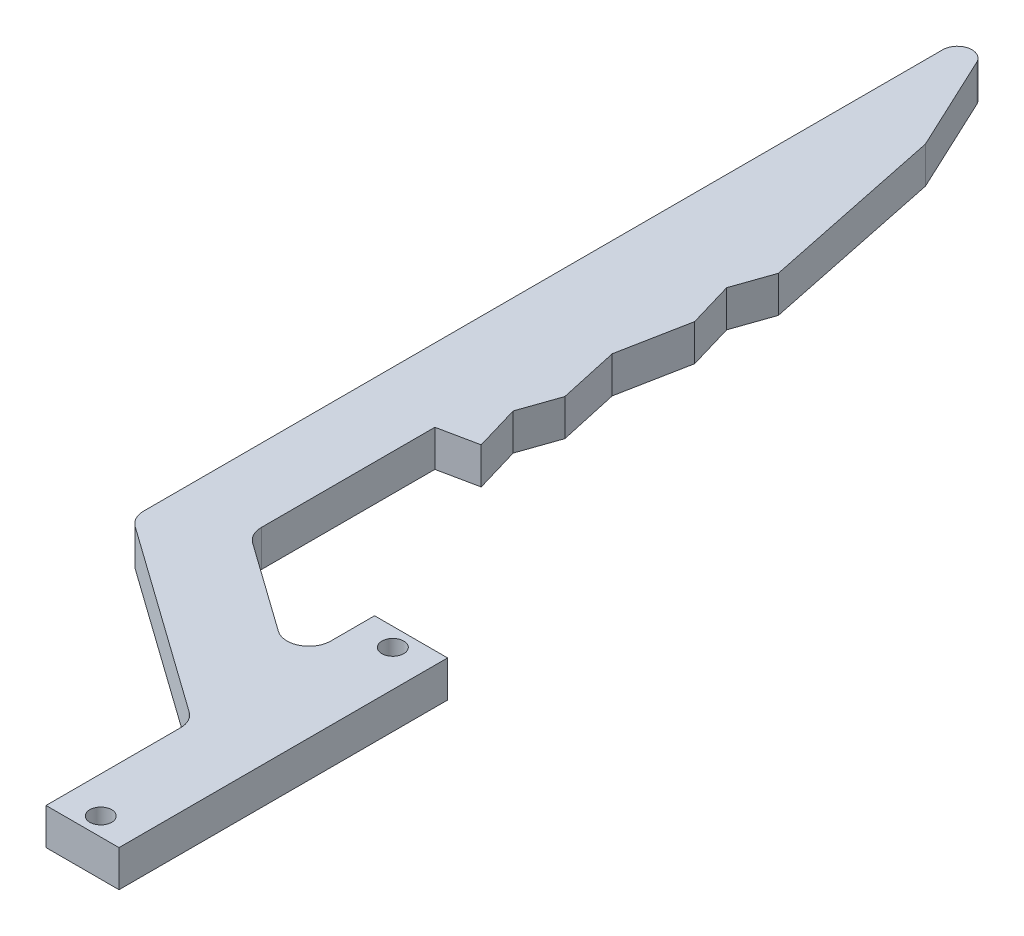
ISO-10303-21;
HEADER;
FILE_DESCRIPTION(('STEP AP214'),'2;1');
FILE_NAME('part.step','',(''),(''),'','','');
FILE_SCHEMA(('AUTOMOTIVE_DESIGN { 1 0 10303 214 1 1 1 1 }'));
ENDSEC;
DATA;
#1=APPLICATION_CONTEXT('core data for automotive mechanical design processes');
#2=APPLICATION_PROTOCOL_DEFINITION('international standard','automotive_design',2000,#1);
#3=PRODUCT_CONTEXT('',#1,'mechanical');
#4=PRODUCT('Part','Part','',(#3));
#5=PRODUCT_RELATED_PRODUCT_CATEGORY('part','',(#4));
#6=PRODUCT_DEFINITION_FORMATION('','',#4);
#7=PRODUCT_DEFINITION_CONTEXT('part definition',#1,'design');
#8=PRODUCT_DEFINITION('design','',#6,#7);
#9=PRODUCT_DEFINITION_SHAPE('','',#8);
#10=(LENGTH_UNIT() NAMED_UNIT(*) SI_UNIT(.MILLI.,.METRE.));
#11=(NAMED_UNIT(*) PLANE_ANGLE_UNIT() SI_UNIT($,.RADIAN.));
#12=(NAMED_UNIT(*) SI_UNIT($,.STERADIAN.) SOLID_ANGLE_UNIT());
#13=UNCERTAINTY_MEASURE_WITH_UNIT(LENGTH_MEASURE(1.E-05),#10,'distance_accuracy_value','');
#14=(GEOMETRIC_REPRESENTATION_CONTEXT(3) GLOBAL_UNCERTAINTY_ASSIGNED_CONTEXT((#13)) GLOBAL_UNIT_ASSIGNED_CONTEXT((#10,
#11,#12)) REPRESENTATION_CONTEXT('',''));
#15=CARTESIAN_POINT('',(0.,0.,0.));
#16=DIRECTION('',(0.,0.,1.));
#17=DIRECTION('',(1.,0.,0.));
#18=AXIS2_PLACEMENT_3D('',#15,#16,#17);
#19=CARTESIAN_POINT('',(-5.,5.,-22.5));
#20=DIRECTION('',(1.,0.,0.));
#21=DIRECTION('',(0.,0.,-1.));
#22=AXIS2_PLACEMENT_3D('',#19,#20,#21);
#23=PLANE('',#22);
#24=DIRECTION('',(0.,0.,1.));
#25=VECTOR('',#24,1.);
#26=CARTESIAN_POINT('',(-5.,5.,-22.5));
#27=LINE('',#26,#25);
#28=CARTESIAN_POINT('',(-5.,5.,4.0698468201842));
#29=VERTEX_POINT('',#28);
#30=CARTESIAN_POINT('',(-5.,5.,22.5));
#31=VERTEX_POINT('',#30);
#32=EDGE_CURVE('E295',#29,#31,#27,.T.);
#33=ORIENTED_EDGE('',*,*,#32,.F.);
#34=DIRECTION('',(0.,1.,0.));
#35=VECTOR('',#34,1.);
#36=CARTESIAN_POINT('',(-5.,0.,4.06984682018421));
#37=LINE('',#36,#35);
#38=CARTESIAN_POINT('',(-5.,0.,4.0698468201842));
#39=VERTEX_POINT('',#38);
#40=EDGE_CURVE('E346',#29,#39,#37,.F.);
#41=ORIENTED_EDGE('',*,*,#40,.T.);
#42=DIRECTION('',(0.,0.,1.));
#43=VECTOR('',#42,1.);
#44=CARTESIAN_POINT('',(-5.,0.,-22.5));
#45=LINE('',#44,#43);
#46=CARTESIAN_POINT('',(-5.,0.,22.5));
#47=VERTEX_POINT('',#46);
#48=EDGE_CURVE('E304',#39,#47,#45,.T.);
#49=ORIENTED_EDGE('',*,*,#48,.T.);
#50=DIRECTION('',(0.,-1.,0.));
#51=VECTOR('',#50,1.);
#52=CARTESIAN_POINT('',(-5.,5.,22.5));
#53=LINE('',#52,#51);
#54=EDGE_CURVE('E315',#31,#47,#53,.T.);
#55=ORIENTED_EDGE('',*,*,#54,.F.);
#56=EDGE_LOOP('',(#33,#41,#49,#55));
#57=FACE_BOUND('',#56,.T.);
#58=ADVANCED_FACE('F43',(#57),#23,.F.);
#59=CARTESIAN_POINT('',(5.,5.,-22.5));
#60=DIRECTION('',(-1.,0.,0.));
#61=DIRECTION('',(0.,0.,1.));
#62=AXIS2_PLACEMENT_3D('',#59,#60,#61);
#63=PLANE('',#62);
#64=DIRECTION('',(0.,0.,-1.));
#65=VECTOR('',#64,1.);
#66=CARTESIAN_POINT('',(5.,0.,-22.5));
#67=LINE('',#66,#65);
#68=CARTESIAN_POINT('',(5.,0.,22.5));
#69=VERTEX_POINT('',#68);
#70=CARTESIAN_POINT('',(5.,0.,-22.5));
#71=VERTEX_POINT('',#70);
#72=EDGE_CURVE('E297',#69,#71,#67,.T.);
#73=ORIENTED_EDGE('',*,*,#72,.T.);
#74=DIRECTION('',(0.,-1.,0.));
#75=VECTOR('',#74,1.);
#76=CARTESIAN_POINT('',(5.,5.,-22.5));
#77=LINE('',#76,#75);
#78=CARTESIAN_POINT('',(5.,5.,-22.5));
#79=VERTEX_POINT('',#78);
#80=EDGE_CURVE('E318',#79,#71,#77,.T.);
#81=ORIENTED_EDGE('',*,*,#80,.F.);
#82=DIRECTION('',(0.,0.,-1.));
#83=VECTOR('',#82,1.);
#84=CARTESIAN_POINT('',(5.,5.,-22.5));
#85=LINE('',#84,#83);
#86=CARTESIAN_POINT('',(5.,5.,22.5));
#87=VERTEX_POINT('',#86);
#88=EDGE_CURVE('E288',#87,#79,#85,.T.);
#89=ORIENTED_EDGE('',*,*,#88,.F.);
#90=DIRECTION('',(0.,-1.,0.));
#91=VECTOR('',#90,1.);
#92=CARTESIAN_POINT('',(5.,5.,22.5));
#93=LINE('',#92,#91);
#94=EDGE_CURVE('E296',#87,#69,#93,.T.);
#95=ORIENTED_EDGE('',*,*,#94,.T.);
#96=EDGE_LOOP('',(#73,#81,#89,#95));
#97=FACE_BOUND('',#96,.T.);
#98=ADVANCED_FACE('F393',(#97),#63,.F.);
#99=CARTESIAN_POINT('',(-5.,5.,-22.5));
#100=DIRECTION('',(0.,0.,1.));
#101=DIRECTION('',(1.,0.,0.));
#102=AXIS2_PLACEMENT_3D('',#99,#100,#101);
#103=PLANE('',#102);
#104=DIRECTION('',(-1.,0.,0.));
#105=VECTOR('',#104,1.);
#106=CARTESIAN_POINT('',(-5.,0.,-22.5));
#107=LINE('',#106,#105);
#108=CARTESIAN_POINT('',(-5.,0.,-22.5));
#109=VERTEX_POINT('',#108);
#110=EDGE_CURVE('E305',#71,#109,#107,.T.);
#111=ORIENTED_EDGE('',*,*,#110,.T.);
#112=DIRECTION('',(0.,-1.,0.));
#113=VECTOR('',#112,1.);
#114=CARTESIAN_POINT('',(-5.,5.,-22.5));
#115=LINE('',#114,#113);
#116=CARTESIAN_POINT('',(-5.,5.,-22.5));
#117=VERTEX_POINT('',#116);
#118=EDGE_CURVE('E312',#117,#109,#115,.T.);
#119=ORIENTED_EDGE('',*,*,#118,.F.);
#120=DIRECTION('',(-1.,0.,0.));
#121=VECTOR('',#120,1.);
#122=CARTESIAN_POINT('',(-5.,5.,-22.5));
#123=LINE('',#122,#121);
#124=EDGE_CURVE('E287',#79,#117,#123,.T.);
#125=ORIENTED_EDGE('',*,*,#124,.F.);
#126=ORIENTED_EDGE('',*,*,#80,.T.);
#127=EDGE_LOOP('',(#111,#119,#125,#126));
#128=FACE_BOUND('',#127,.T.);
#129=ADVANCED_FACE('F399',(#128),#103,.F.);
#130=CARTESIAN_POINT('',(-5.,0.,-16.5095835169366));
#131=VERTEX_POINT('',#130);
#132=EDGE_CURVE('E308',#109,#131,#45,.T.);
#133=ORIENTED_EDGE('',*,*,#132,.T.);
#134=DIRECTION('',(0.,1.,0.));
#135=VECTOR('',#134,1.);
#136=CARTESIAN_POINT('',(-5.,5.,-16.5095835169366));
#137=LINE('',#136,#135);
#138=CARTESIAN_POINT('',(-5.,5.,-16.5095835169366));
#139=VERTEX_POINT('',#138);
#140=EDGE_CURVE('E333',#131,#139,#137,.T.);
#141=ORIENTED_EDGE('',*,*,#140,.T.);
#142=EDGE_CURVE('E291',#117,#139,#27,.T.);
#143=ORIENTED_EDGE('',*,*,#142,.F.);
#144=ORIENTED_EDGE('',*,*,#118,.T.);
#145=EDGE_LOOP('',(#133,#141,#143,#144));
#146=FACE_BOUND('',#145,.T.);
#147=ADVANCED_FACE('F392',(#146),#23,.F.);
#148=CARTESIAN_POINT('',(-5.,5.,22.5));
#149=DIRECTION('',(0.,0.,-1.));
#150=DIRECTION('',(-1.,0.,0.));
#151=AXIS2_PLACEMENT_3D('',#148,#149,#150);
#152=PLANE('',#151);
#153=DIRECTION('',(1.,0.,0.));
#154=VECTOR('',#153,1.);
#155=CARTESIAN_POINT('',(-5.,0.,22.5));
#156=LINE('',#155,#154);
#157=EDGE_CURVE('E289',#47,#69,#156,.T.);
#158=ORIENTED_EDGE('',*,*,#157,.T.);
#159=ORIENTED_EDGE('',*,*,#94,.F.);
#160=DIRECTION('',(1.,0.,0.));
#161=VECTOR('',#160,1.);
#162=CARTESIAN_POINT('',(-5.,5.,22.5));
#163=LINE('',#162,#161);
#164=EDGE_CURVE('E298',#31,#87,#163,.T.);
#165=ORIENTED_EDGE('',*,*,#164,.F.);
#166=ORIENTED_EDGE('',*,*,#54,.T.);
#167=EDGE_LOOP('',(#158,#159,#165,#166));
#168=FACE_BOUND('',#167,.T.);
#169=ADVANCED_FACE('F408',(#168),#152,.F.);
#170=CARTESIAN_POINT('',(0.,5.,0.));
#171=DIRECTION('',(0.,1.,0.));
#172=DIRECTION('',(0.,0.,1.));
#173=AXIS2_PLACEMENT_3D('',#170,#171,#172);
#174=PLANE('',#173);
#175=DIRECTION('',(0.,0.,-1.));
#176=VECTOR('',#175,1.);
#177=CARTESIAN_POINT('',(-33.2276310093814,5.,0.));
#178=LINE('',#177,#176);
#179=CARTESIAN_POINT('',(-33.2276310093814,5.,-19.1253502843522));
#180=VERTEX_POINT('',#179);
#181=CARTESIAN_POINT('',(-33.2276310093814,5.,-128.54358630925));
#182=VERTEX_POINT('',#181);
#183=EDGE_CURVE('E274',#180,#182,#178,.T.);
#184=ORIENTED_EDGE('',*,*,#183,.F.);
#185=CARTESIAN_POINT('',(-30.2276310093814,5.,-19.1253502843522));
#186=DIRECTION('',(0.,1.,0.));
#187=DIRECTION('',(0.,0.,1.));
#188=AXIS2_PLACEMENT_3D('',#185,#186,#187);
#189=CIRCLE('',#188,3.);
#190=CARTESIAN_POINT('',(-31.9678759776965,5.,-16.6816752956816));
#191=VERTEX_POINT('',#190);
#192=EDGE_CURVE('E64',#180,#191,#189,.T.);
#193=ORIENTED_EDGE('',*,*,#192,.T.);
#194=DIRECTION('',(-0.814558329556858,0.,-0.580081656105018));
#195=VECTOR('',#194,1.);
#196=CARTESIAN_POINT('',(-2.87475757798385,5.,4.03677259220125));
#197=LINE('',#196,#195);
#198=CARTESIAN_POINT('',(-6.25975503168495,5.,1.62617183151363));
#199=VERTEX_POINT('',#198);
#200=EDGE_CURVE('E280',#199,#191,#197,.T.);
#201=ORIENTED_EDGE('',*,*,#200,.F.);
#202=CARTESIAN_POINT('',(-8.,5.,4.06984682018421));
#203=DIRECTION('',(0.,1.,0.));
#204=DIRECTION('',(0.,0.,1.));
#205=AXIS2_PLACEMENT_3D('',#202,#203,#204);
#206=CIRCLE('',#205,3.);
#207=EDGE_CURVE('E356',#199,#29,#206,.F.);
#208=ORIENTED_EDGE('',*,*,#207,.T.);
#209=ORIENTED_EDGE('',*,*,#32,.T.);
#210=ORIENTED_EDGE('',*,*,#164,.T.);
#211=ORIENTED_EDGE('',*,*,#88,.T.);
#212=ORIENTED_EDGE('',*,*,#124,.T.);
#213=ORIENTED_EDGE('',*,*,#142,.T.);
#214=CARTESIAN_POINT('',(-8.,5.,-16.5095835169366));
#215=DIRECTION('',(0.,1.,0.));
#216=DIRECTION('',(0.,0.,1.));
#217=AXIS2_PLACEMENT_3D('',#214,#215,#216);
#218=CIRCLE('',#217,3.);
#219=CARTESIAN_POINT('',(-9.74024496831506,5.,-14.065908528266));
#220=VERTEX_POINT('',#219);
#221=EDGE_CURVE('E348',#139,#220,#218,.F.);
#222=ORIENTED_EDGE('',*,*,#221,.T.);
#223=DIRECTION('',(0.814558329556858,0.,0.580081656105018));
#224=VECTOR('',#223,1.);
#225=CARTESIAN_POINT('',(3.36874620983818,5.,-4.73043795904831));
#226=LINE('',#225,#224);
#227=CARTESIAN_POINT('',(-21.9678759776965,5.,-22.7737250084214));
#228=VERTEX_POINT('',#227);
#229=EDGE_CURVE('E269',#228,#220,#226,.T.);
#230=ORIENTED_EDGE('',*,*,#229,.F.);
#231=CARTESIAN_POINT('',(-20.2276310093814,5.,-25.217399997092));
#232=DIRECTION('',(0.,1.,0.));
#233=DIRECTION('',(0.,0.,1.));
#234=AXIS2_PLACEMENT_3D('',#231,#232,#233);
#235=CIRCLE('',#234,3.);
#236=CARTESIAN_POINT('',(-23.2276310093814,5.,-25.217399997092));
#237=VERTEX_POINT('',#236);
#238=EDGE_CURVE('E352',#228,#237,#235,.F.);
#239=ORIENTED_EDGE('',*,*,#238,.T.);
#240=DIRECTION('',(0.,0.,1.));
#241=VECTOR('',#240,1.);
#242=CARTESIAN_POINT('',(-23.2276310093814,5.,0.));
#243=LINE('',#242,#241);
#244=CARTESIAN_POINT('',(-23.2276310093814,5.,-48.9857324203167));
#245=VERTEX_POINT('',#244);
#246=EDGE_CURVE('E224',#245,#237,#243,.T.);
#247=ORIENTED_EDGE('',*,*,#246,.F.);
#248=DIRECTION('',(0.979250718928546,0.,-0.20265248450963));
#249=VECTOR('',#248,1.);
#250=CARTESIAN_POINT('',(-17.9701283005233,5.,-50.0737540736804));
#251=LINE('',#250,#249);
#252=CARTESIAN_POINT('',(-17.9701283005233,5.,-50.0737540736804));
#253=VERTEX_POINT('',#252);
#254=EDGE_CURVE('E205',#245,#253,#251,.T.);
#255=ORIENTED_EDGE('',*,*,#254,.T.);
#256=DIRECTION('',(-0.282825554620811,0.,-0.959171364070796));
#257=VECTOR('',#256,1.);
#258=CARTESIAN_POINT('',(-19.8005117190085,5.,-56.2812955479111));
#259=LINE('',#258,#257);
#260=CARTESIAN_POINT('',(-19.8005117190085,5.,-56.2812955479111));
#261=VERTEX_POINT('',#260);
#262=EDGE_CURVE('E215',#253,#261,#259,.T.);
#263=ORIENTED_EDGE('',*,*,#262,.T.);
#264=DIRECTION('',(0.329137182624405,0.,-0.944282116220607));
#265=VECTOR('',#264,1.);
#266=CARTESIAN_POINT('',(-17.9701283005233,5.,-61.5325962794806));
#267=LINE('',#266,#265);
#268=CARTESIAN_POINT('',(-17.9701283005233,5.,-61.5325962794806));
#269=VERTEX_POINT('',#268);
#270=EDGE_CURVE('E220',#261,#269,#267,.T.);
#271=ORIENTED_EDGE('',*,*,#270,.T.);
#272=DIRECTION('',(-0.21490211562524,0.,-0.976635592582922));
#273=VECTOR('',#272,1.);
#274=CARTESIAN_POINT('',(-19.8005117190085,5.,-69.8508838373545));
#275=LINE('',#274,#273);
#276=CARTESIAN_POINT('',(-19.8005117190085,5.,-69.8508838373545));
#277=VERTEX_POINT('',#276);
#278=EDGE_CURVE('E233',#269,#277,#275,.T.);
#279=ORIENTED_EDGE('',*,*,#278,.T.);
#280=DIRECTION('',(0.18997742787162,0.,-0.981788458324543));
#281=VECTOR('',#280,1.);
#282=CARTESIAN_POINT('',(-17.9701283005233,5.,-79.3101618932283));
#283=LINE('',#282,#281);
#284=CARTESIAN_POINT('',(-17.9701283005233,5.,-79.3101618932283));
#285=VERTEX_POINT('',#284);
#286=EDGE_CURVE('E232',#277,#285,#283,.T.);
#287=ORIENTED_EDGE('',*,*,#286,.T.);
#288=DIRECTION('',(-0.282825554620811,0.,-0.959171364070796));
#289=VECTOR('',#288,1.);
#290=CARTESIAN_POINT('',(-19.8005117190085,5.,-85.517703367459));
#291=LINE('',#290,#289);
#292=CARTESIAN_POINT('',(-19.8005117190085,5.,-85.517703367459));
#293=VERTEX_POINT('',#292);
#294=EDGE_CURVE('E240',#285,#293,#291,.T.);
#295=ORIENTED_EDGE('',*,*,#294,.T.);
#296=DIRECTION('',(0.329137182624406,0.,-0.944282116220607));
#297=VECTOR('',#296,1.);
#298=CARTESIAN_POINT('',(-17.9701283005233,5.,-90.7690040990285));
#299=LINE('',#298,#297);
#300=CARTESIAN_POINT('',(-17.9701283005233,5.,-90.7690040990285));
#301=VERTEX_POINT('',#300);
#302=EDGE_CURVE('E238',#293,#301,#299,.T.);
#303=ORIENTED_EDGE('',*,*,#302,.T.);
#304=DIRECTION('',(-0.20265248450963,0.,-0.979250718928546));
#305=VECTOR('',#304,1.);
#306=CARTESIAN_POINT('',(-23.2276310093814,5.,-116.174137028319));
#307=LINE('',#306,#305);
#308=CARTESIAN_POINT('',(-23.2276310093814,5.,-116.174137028319));
#309=VERTEX_POINT('',#308);
#310=EDGE_CURVE('E241',#301,#309,#307,.T.);
#311=ORIENTED_EDGE('',*,*,#310,.T.);
#312=DIRECTION('',(-0.42404039805158,0.,-0.905643274595609));
#313=VECTOR('',#312,1.);
#314=CARTESIAN_POINT('',(-33.2276310093814,5.,-137.53161331494));
#315=LINE('',#314,#313);
#316=CARTESIAN_POINT('',(-29.4163444601902,5.,-129.391667105353));
#317=VERTEX_POINT('',#316);
#318=EDGE_CURVE('E221',#309,#317,#315,.T.);
#319=ORIENTED_EDGE('',*,*,#318,.T.);
#320=CARTESIAN_POINT('',(-31.2276310093814,5.,-128.54358630925));
#321=DIRECTION('',(0.,1.,0.));
#322=DIRECTION('',(0.,0.,1.));
#323=AXIS2_PLACEMENT_3D('',#320,#321,#322);
#324=CIRCLE('',#323,2.);
#325=EDGE_CURVE('E327',#317,#182,#324,.T.);
#326=ORIENTED_EDGE('',*,*,#325,.T.);
#327=EDGE_LOOP('',(#184,#193,#201,#208,#209,#210,#211,#212,#213,#222,#230,#239,#247,#255,#263,
#271,#279,#287,#295,#303,#311,#319,#326));
#328=FACE_BOUND('',#327,.T.);
#329=CARTESIAN_POINT('',(0.,5.,20.));
#330=DIRECTION('',(0.,1.,0.));
#331=DIRECTION('',(0.,0.,1.));
#332=AXIS2_PLACEMENT_3D('',#329,#330,#331);
#333=CIRCLE('',#332,1.5);
#334=CARTESIAN_POINT('',(0.,5.,21.5));
#335=VERTEX_POINT('',#334);
#336=EDGE_CURVE('E278',#335,#335,#333,.T.);
#337=ORIENTED_EDGE('',*,*,#336,.F.);
#338=EDGE_LOOP('',(#337));
#339=FACE_BOUND('',#338,.T.);
#340=CARTESIAN_POINT('',(0.,5.,-20.));
#341=DIRECTION('',(0.,1.,0.));
#342=DIRECTION('',(0.,0.,1.));
#343=AXIS2_PLACEMENT_3D('',#340,#341,#342);
#344=CIRCLE('',#343,1.5);
#345=CARTESIAN_POINT('',(0.,5.,-18.5));
#346=VERTEX_POINT('',#345);
#347=EDGE_CURVE('E267',#346,#346,#344,.T.);
#348=ORIENTED_EDGE('',*,*,#347,.F.);
#349=EDGE_LOOP('',(#348));
#350=FACE_BOUND('',#349,.T.);
#351=ADVANCED_FACE('F219',(#328,#339,#350),#174,.T.);
#352=CARTESIAN_POINT('',(0.,0.,0.));
#353=DIRECTION('',(0.,1.,0.));
#354=DIRECTION('',(0.,0.,1.));
#355=AXIS2_PLACEMENT_3D('',#352,#353,#354);
#356=PLANE('',#355);
#357=DIRECTION('',(0.814558329556858,0.,0.580081656105018));
#358=VECTOR('',#357,1.);
#359=CARTESIAN_POINT('',(-2.87475757798385,0.,4.03677259220125));
#360=LINE('',#359,#358);
#361=CARTESIAN_POINT('',(-31.9678759776965,0.,-16.6816752956816));
#362=VERTEX_POINT('',#361);
#363=CARTESIAN_POINT('',(-6.25975503168495,0.,1.62617183151363));
#364=VERTEX_POINT('',#363);
#365=EDGE_CURVE('E263',#362,#364,#360,.T.);
#366=ORIENTED_EDGE('',*,*,#365,.F.);
#367=CARTESIAN_POINT('',(-30.2276310093814,0.,-19.1253502843522));
#368=DIRECTION('',(0.,1.,0.));
#369=DIRECTION('',(0.,0.,1.));
#370=AXIS2_PLACEMENT_3D('',#367,#368,#369);
#371=CIRCLE('',#370,3.);
#372=CARTESIAN_POINT('',(-33.2276310093814,0.,-19.1253502843522));
#373=VERTEX_POINT('',#372);
#374=EDGE_CURVE('E11',#362,#373,#371,.F.);
#375=ORIENTED_EDGE('',*,*,#374,.T.);
#376=DIRECTION('',(0.,0.,1.));
#377=VECTOR('',#376,1.);
#378=CARTESIAN_POINT('',(-33.2276310093814,0.,0.));
#379=LINE('',#378,#377);
#380=CARTESIAN_POINT('',(-33.2276310093814,0.,-128.54358630925));
#381=VERTEX_POINT('',#380);
#382=EDGE_CURVE('E257',#381,#373,#379,.T.);
#383=ORIENTED_EDGE('',*,*,#382,.F.);
#384=CARTESIAN_POINT('',(-31.2276310093814,0.,-128.54358630925));
#385=DIRECTION('',(0.,1.,0.));
#386=DIRECTION('',(0.,0.,1.));
#387=AXIS2_PLACEMENT_3D('',#384,#385,#386);
#388=CIRCLE('',#387,2.);
#389=CARTESIAN_POINT('',(-29.4163444601902,0.,-129.391667105353));
#390=VERTEX_POINT('',#389);
#391=EDGE_CURVE('E334',#381,#390,#388,.F.);
#392=ORIENTED_EDGE('',*,*,#391,.T.);
#393=DIRECTION('',(0.42404039805158,0.,0.905643274595609));
#394=VECTOR('',#393,1.);
#395=CARTESIAN_POINT('',(-33.2276310093814,0.,-137.53161331494));
#396=LINE('',#395,#394);
#397=CARTESIAN_POINT('',(-23.2276310093814,0.,-116.174137028319));
#398=VERTEX_POINT('',#397);
#399=EDGE_CURVE('E272',#390,#398,#396,.T.);
#400=ORIENTED_EDGE('',*,*,#399,.T.);
#401=DIRECTION('',(0.20265248450963,0.,0.979250718928546));
#402=VECTOR('',#401,1.);
#403=CARTESIAN_POINT('',(-23.2276310093814,0.,-116.174137028319));
#404=LINE('',#403,#402);
#405=CARTESIAN_POINT('',(-17.9701283005233,0.,-90.7690040990285));
#406=VERTEX_POINT('',#405);
#407=EDGE_CURVE('E446',#398,#406,#404,.T.);
#408=ORIENTED_EDGE('',*,*,#407,.T.);
#409=DIRECTION('',(-0.329137182624406,0.,0.944282116220607));
#410=VECTOR('',#409,1.);
#411=CARTESIAN_POINT('',(-17.9701283005233,0.,-90.7690040990285));
#412=LINE('',#411,#410);
#413=CARTESIAN_POINT('',(-19.8005117190085,0.,-85.517703367459));
#414=VERTEX_POINT('',#413);
#415=EDGE_CURVE('E448',#406,#414,#412,.T.);
#416=ORIENTED_EDGE('',*,*,#415,.T.);
#417=DIRECTION('',(0.282825554620811,0.,0.959171364070796));
#418=VECTOR('',#417,1.);
#419=CARTESIAN_POINT('',(-19.8005117190085,0.,-85.517703367459));
#420=LINE('',#419,#418);
#421=CARTESIAN_POINT('',(-17.9701283005233,0.,-79.3101618932283));
#422=VERTEX_POINT('',#421);
#423=EDGE_CURVE('E441',#414,#422,#420,.T.);
#424=ORIENTED_EDGE('',*,*,#423,.T.);
#425=DIRECTION('',(-0.18997742787162,0.,0.981788458324543));
#426=VECTOR('',#425,1.);
#427=CARTESIAN_POINT('',(-17.9701283005233,0.,-79.3101618932283));
#428=LINE('',#427,#426);
#429=CARTESIAN_POINT('',(-19.8005117190085,0.,-69.8508838373545));
#430=VERTEX_POINT('',#429);
#431=EDGE_CURVE('E445',#422,#430,#428,.T.);
#432=ORIENTED_EDGE('',*,*,#431,.T.);
#433=DIRECTION('',(0.21490211562524,0.,0.976635592582922));
#434=VECTOR('',#433,1.);
#435=CARTESIAN_POINT('',(-19.8005117190085,0.,-69.8508838373545));
#436=LINE('',#435,#434);
#437=CARTESIAN_POINT('',(-17.9701283005233,0.,-61.5325962794806));
#438=VERTEX_POINT('',#437);
#439=EDGE_CURVE('E439',#430,#438,#436,.T.);
#440=ORIENTED_EDGE('',*,*,#439,.T.);
#441=DIRECTION('',(-0.329137182624405,0.,0.944282116220608));
#442=VECTOR('',#441,1.);
#443=CARTESIAN_POINT('',(-17.9701283005233,0.,-61.5325962794806));
#444=LINE('',#443,#442);
#445=CARTESIAN_POINT('',(-19.8005117190085,0.,-56.2812955479111));
#446=VERTEX_POINT('',#445);
#447=EDGE_CURVE('E436',#438,#446,#444,.T.);
#448=ORIENTED_EDGE('',*,*,#447,.T.);
#449=DIRECTION('',(0.282825554620811,0.,0.959171364070796));
#450=VECTOR('',#449,1.);
#451=CARTESIAN_POINT('',(-19.8005117190085,0.,-56.2812955479111));
#452=LINE('',#451,#450);
#453=CARTESIAN_POINT('',(-17.9701283005233,0.,-50.0737540736804));
#454=VERTEX_POINT('',#453);
#455=EDGE_CURVE('E432',#446,#454,#452,.T.);
#456=ORIENTED_EDGE('',*,*,#455,.T.);
#457=DIRECTION('',(-0.979250718928546,0.,0.20265248450963));
#458=VECTOR('',#457,1.);
#459=CARTESIAN_POINT('',(-17.9701283005233,0.,-50.0737540736804));
#460=LINE('',#459,#458);
#461=CARTESIAN_POINT('',(-23.2276310093814,0.,-48.9857324203167));
#462=VERTEX_POINT('',#461);
#463=EDGE_CURVE('E202',#454,#462,#460,.T.);
#464=ORIENTED_EDGE('',*,*,#463,.T.);
#465=DIRECTION('',(0.,0.,-1.));
#466=VECTOR('',#465,1.);
#467=CARTESIAN_POINT('',(-23.2276310093814,0.,0.));
#468=LINE('',#467,#466);
#469=CARTESIAN_POINT('',(-23.2276310093814,0.,-25.217399997092));
#470=VERTEX_POINT('',#469);
#471=EDGE_CURVE('E262',#470,#462,#468,.T.);
#472=ORIENTED_EDGE('',*,*,#471,.F.);
#473=CARTESIAN_POINT('',(-20.2276310093814,0.,-25.217399997092));
#474=DIRECTION('',(0.,1.,0.));
#475=DIRECTION('',(0.,0.,1.));
#476=AXIS2_PLACEMENT_3D('',#473,#474,#475);
#477=CIRCLE('',#476,3.);
#478=CARTESIAN_POINT('',(-21.9678759776965,0.,-22.7737250084214));
#479=VERTEX_POINT('',#478);
#480=EDGE_CURVE('E358',#470,#479,#477,.T.);
#481=ORIENTED_EDGE('',*,*,#480,.T.);
#482=DIRECTION('',(-0.814558329556858,0.,-0.580081656105018));
#483=VECTOR('',#482,1.);
#484=CARTESIAN_POINT('',(3.36874620983818,0.,-4.73043795904831));
#485=LINE('',#484,#483);
#486=CARTESIAN_POINT('',(-9.74024496831506,0.,-14.065908528266));
#487=VERTEX_POINT('',#486);
#488=EDGE_CURVE('E266',#487,#479,#485,.T.);
#489=ORIENTED_EDGE('',*,*,#488,.F.);
#490=CARTESIAN_POINT('',(-8.,0.,-16.5095835169366));
#491=DIRECTION('',(0.,1.,0.));
#492=DIRECTION('',(0.,0.,1.));
#493=AXIS2_PLACEMENT_3D('',#490,#491,#492);
#494=CIRCLE('',#493,3.);
#495=EDGE_CURVE('E355',#487,#131,#494,.T.);
#496=ORIENTED_EDGE('',*,*,#495,.T.);
#497=ORIENTED_EDGE('',*,*,#132,.F.);
#498=ORIENTED_EDGE('',*,*,#110,.F.);
#499=ORIENTED_EDGE('',*,*,#72,.F.);
#500=ORIENTED_EDGE('',*,*,#157,.F.);
#501=ORIENTED_EDGE('',*,*,#48,.F.);
#502=CARTESIAN_POINT('',(-8.,0.,4.06984682018421));
#503=DIRECTION('',(0.,1.,0.));
#504=DIRECTION('',(0.,0.,1.));
#505=AXIS2_PLACEMENT_3D('',#502,#503,#504);
#506=CIRCLE('',#505,3.);
#507=EDGE_CURVE('E359',#39,#364,#506,.T.);
#508=ORIENTED_EDGE('',*,*,#507,.T.);
#509=EDGE_LOOP('',(#366,#375,#383,#392,#400,#408,#416,#424,#432,#440,#448,#456,#464,#472,#481,
#489,#496,#497,#498,#499,#500,#501,#508));
#510=FACE_BOUND('',#509,.T.);
#511=CARTESIAN_POINT('',(0.,0.,20.));
#512=DIRECTION('',(0.,1.,0.));
#513=DIRECTION('',(0.,0.,1.));
#514=AXIS2_PLACEMENT_3D('',#511,#512,#513);
#515=CIRCLE('',#514,1.5);
#516=CARTESIAN_POINT('',(0.,0.,21.5));
#517=VERTEX_POINT('',#516);
#518=EDGE_CURVE('E301',#517,#517,#515,.T.);
#519=ORIENTED_EDGE('',*,*,#518,.T.);
#520=EDGE_LOOP('',(#519));
#521=FACE_BOUND('',#520,.T.);
#522=CARTESIAN_POINT('',(0.,0.,-20.));
#523=DIRECTION('',(0.,1.,0.));
#524=DIRECTION('',(0.,0.,1.));
#525=AXIS2_PLACEMENT_3D('',#522,#523,#524);
#526=CIRCLE('',#525,1.5);
#527=CARTESIAN_POINT('',(0.,0.,-18.5));
#528=VERTEX_POINT('',#527);
#529=EDGE_CURVE('E281',#528,#528,#526,.T.);
#530=ORIENTED_EDGE('',*,*,#529,.T.);
#531=EDGE_LOOP('',(#530));
#532=FACE_BOUND('',#531,.T.);
#533=ADVANCED_FACE('F377',(#510,#521,#532),#356,.F.);
#534=CARTESIAN_POINT('',(0.,-3.,-20.));
#535=DIRECTION('',(0.,1.,0.));
#536=DIRECTION('',(0.,0.,1.));
#537=AXIS2_PLACEMENT_3D('',#534,#535,#536);
#538=CYLINDRICAL_SURFACE('',#537,1.5);
#539=ORIENTED_EDGE('',*,*,#347,.T.);
#540=EDGE_LOOP('',(#539));
#541=FACE_BOUND('',#540,.T.);
#542=ORIENTED_EDGE('',*,*,#529,.F.);
#543=EDGE_LOOP('',(#542));
#544=FACE_BOUND('',#543,.T.);
#545=ADVANCED_FACE('F502',(#541,#544),#538,.F.);
#546=CARTESIAN_POINT('',(0.,-3.,20.));
#547=DIRECTION('',(0.,1.,0.));
#548=DIRECTION('',(0.,0.,1.));
#549=AXIS2_PLACEMENT_3D('',#546,#547,#548);
#550=CYLINDRICAL_SURFACE('',#549,1.5);
#551=ORIENTED_EDGE('',*,*,#336,.T.);
#552=EDGE_LOOP('',(#551));
#553=FACE_BOUND('',#552,.T.);
#554=ORIENTED_EDGE('',*,*,#518,.F.);
#555=EDGE_LOOP('',(#554));
#556=FACE_BOUND('',#555,.T.);
#557=ADVANCED_FACE('F496',(#553,#556),#550,.F.);
#558=CARTESIAN_POINT('',(-23.2276310093814,-110.720914733544,0.));
#559=DIRECTION('',(-1.,0.,0.));
#560=DIRECTION('',(0.,0.,1.));
#561=AXIS2_PLACEMENT_3D('',#558,#559,#560);
#562=PLANE('',#561);
#563=ORIENTED_EDGE('',*,*,#246,.T.);
#564=DIRECTION('',(0.,1.,0.));
#565=VECTOR('',#564,1.);
#566=CARTESIAN_POINT('',(-23.2276310093814,0.,-25.217399997092));
#567=LINE('',#566,#565);
#568=EDGE_CURVE('E341',#237,#470,#567,.F.);
#569=ORIENTED_EDGE('',*,*,#568,.T.);
#570=ORIENTED_EDGE('',*,*,#471,.T.);
#571=DIRECTION('',(0.,1.,0.));
#572=VECTOR('',#571,1.);
#573=CARTESIAN_POINT('',(-23.2276310093814,-89.8507897144795,-48.9857324203167));
#574=LINE('',#573,#572);
#575=EDGE_CURVE('E207',#462,#245,#574,.T.);
#576=ORIENTED_EDGE('',*,*,#575,.T.);
#577=EDGE_LOOP('',(#563,#569,#570,#576));
#578=FACE_BOUND('',#577,.T.);
#579=ADVANCED_FACE('F435',(#578),#562,.F.);
#580=CARTESIAN_POINT('',(-33.2276310093814,-110.720914733544,0.));
#581=DIRECTION('',(1.,0.,0.));
#582=DIRECTION('',(0.,0.,-1.));
#583=AXIS2_PLACEMENT_3D('',#580,#581,#582);
#584=PLANE('',#583);
#585=ORIENTED_EDGE('',*,*,#382,.T.);
#586=DIRECTION('',(0.,1.,0.));
#587=VECTOR('',#586,1.);
#588=CARTESIAN_POINT('',(-33.2276310093814,-110.720914733544,-19.1253502843522));
#589=LINE('',#588,#587);
#590=EDGE_CURVE('E361',#373,#180,#589,.T.);
#591=ORIENTED_EDGE('',*,*,#590,.T.);
#592=ORIENTED_EDGE('',*,*,#183,.T.);
#593=DIRECTION('',(0.,1.,0.));
#594=VECTOR('',#593,1.);
#595=CARTESIAN_POINT('',(-33.2276310093814,0.,-128.54358630925));
#596=LINE('',#595,#594);
#597=EDGE_CURVE('E332',#182,#381,#596,.F.);
#598=ORIENTED_EDGE('',*,*,#597,.T.);
#599=EDGE_LOOP('',(#585,#591,#592,#598));
#600=FACE_BOUND('',#599,.T.);
#601=ADVANCED_FACE('F366',(#600),#584,.F.);
#602=CARTESIAN_POINT('',(-2.87475757798385,-110.720914733544,4.03677259220125));
#603=DIRECTION('',(0.580081656105018,0.,-0.814558329556858));
#604=DIRECTION('',(-0.814558329556858,0.,-0.580081656105018));
#605=AXIS2_PLACEMENT_3D('',#602,#603,#604);
#606=PLANE('',#605);
#607=ORIENTED_EDGE('',*,*,#200,.T.);
#608=DIRECTION('',(0.,1.,0.));
#609=VECTOR('',#608,1.);
#610=CARTESIAN_POINT('',(-31.9678759776965,-110.720914733544,-16.6816752956816));
#611=LINE('',#610,#609);
#612=EDGE_CURVE('E51',#191,#362,#611,.F.);
#613=ORIENTED_EDGE('',*,*,#612,.T.);
#614=ORIENTED_EDGE('',*,*,#365,.T.);
#615=DIRECTION('',(0.,1.,0.));
#616=VECTOR('',#615,1.);
#617=CARTESIAN_POINT('',(-6.25975503168495,5.,1.62617183151363));
#618=LINE('',#617,#616);
#619=EDGE_CURVE('E344',#364,#199,#618,.T.);
#620=ORIENTED_EDGE('',*,*,#619,.T.);
#621=EDGE_LOOP('',(#607,#613,#614,#620));
#622=FACE_BOUND('',#621,.T.);
#623=ADVANCED_FACE('F493',(#622),#606,.F.);
#624=CARTESIAN_POINT('',(3.36874620983818,-110.720914733544,-4.73043795904831));
#625=DIRECTION('',(-0.580081656105018,0.,0.814558329556858));
#626=DIRECTION('',(0.814558329556858,0.,0.580081656105018));
#627=AXIS2_PLACEMENT_3D('',#624,#625,#626);
#628=PLANE('',#627);
#629=ORIENTED_EDGE('',*,*,#229,.T.);
#630=DIRECTION('',(0.,1.,0.));
#631=VECTOR('',#630,1.);
#632=CARTESIAN_POINT('',(-9.74024496831506,0.,-14.065908528266));
#633=LINE('',#632,#631);
#634=EDGE_CURVE('E343',#220,#487,#633,.F.);
#635=ORIENTED_EDGE('',*,*,#634,.T.);
#636=ORIENTED_EDGE('',*,*,#488,.T.);
#637=DIRECTION('',(0.,1.,0.));
#638=VECTOR('',#637,1.);
#639=CARTESIAN_POINT('',(-21.9678759776965,5.,-22.7737250084214));
#640=LINE('',#639,#638);
#641=EDGE_CURVE('E336',#479,#228,#640,.T.);
#642=ORIENTED_EDGE('',*,*,#641,.T.);
#643=EDGE_LOOP('',(#629,#635,#636,#642));
#644=FACE_BOUND('',#643,.T.);
#645=ADVANCED_FACE('F422',(#644),#628,.F.);
#646=CARTESIAN_POINT('',(-33.2276310093814,-89.8507897144795,-137.53161331494));
#647=DIRECTION('',(0.905643274595609,0.,-0.42404039805158));
#648=DIRECTION('',(-0.42404039805158,0.,-0.905643274595609));
#649=AXIS2_PLACEMENT_3D('',#646,#647,#648);
#650=PLANE('',#649);
#651=ORIENTED_EDGE('',*,*,#399,.F.);
#652=DIRECTION('',(0.,1.,0.));
#653=VECTOR('',#652,1.);
#654=CARTESIAN_POINT('',(-29.4163444601902,5.,-129.391667105353));
#655=LINE('',#654,#653);
#656=EDGE_CURVE('E321',#390,#317,#655,.T.);
#657=ORIENTED_EDGE('',*,*,#656,.T.);
#658=ORIENTED_EDGE('',*,*,#318,.F.);
#659=DIRECTION('',(0.,1.,0.));
#660=VECTOR('',#659,1.);
#661=CARTESIAN_POINT('',(-23.2276310093814,-89.8507897144795,-116.174137028319));
#662=LINE('',#661,#660);
#663=EDGE_CURVE('E248',#398,#309,#662,.T.);
#664=ORIENTED_EDGE('',*,*,#663,.F.);
#665=EDGE_LOOP('',(#651,#657,#658,#664));
#666=FACE_BOUND('',#665,.T.);
#667=ADVANCED_FACE('F460',(#666),#650,.T.);
#668=CARTESIAN_POINT('',(-23.2276310093814,-89.8507897144795,-116.174137028319));
#669=DIRECTION('',(0.979250718928546,0.,-0.20265248450963));
#670=DIRECTION('',(-0.20265248450963,0.,-0.979250718928546));
#671=AXIS2_PLACEMENT_3D('',#668,#669,#670);
#672=PLANE('',#671);
#673=ORIENTED_EDGE('',*,*,#407,.F.);
#674=ORIENTED_EDGE('',*,*,#663,.T.);
#675=ORIENTED_EDGE('',*,*,#310,.F.);
#676=DIRECTION('',(0.,1.,0.));
#677=VECTOR('',#676,1.);
#678=CARTESIAN_POINT('',(-17.9701283005233,-89.8507897144795,-90.7690040990285));
#679=LINE('',#678,#677);
#680=EDGE_CURVE('E246',#406,#301,#679,.T.);
#681=ORIENTED_EDGE('',*,*,#680,.F.);
#682=EDGE_LOOP('',(#673,#674,#675,#681));
#683=FACE_BOUND('',#682,.T.);
#684=ADVANCED_FACE('F454',(#683),#672,.T.);
#685=CARTESIAN_POINT('',(-17.9701283005233,-89.8507897144795,-90.7690040990285));
#686=DIRECTION('',(0.944282116220607,0.,0.329137182624406));
#687=DIRECTION('',(0.329137182624406,0.,-0.944282116220607));
#688=AXIS2_PLACEMENT_3D('',#685,#686,#687);
#689=PLANE('',#688);
#690=ORIENTED_EDGE('',*,*,#415,.F.);
#691=ORIENTED_EDGE('',*,*,#680,.T.);
#692=ORIENTED_EDGE('',*,*,#302,.F.);
#693=DIRECTION('',(0.,1.,0.));
#694=VECTOR('',#693,1.);
#695=CARTESIAN_POINT('',(-19.8005117190085,-89.8507897144795,-85.517703367459));
#696=LINE('',#695,#694);
#697=EDGE_CURVE('E249',#414,#293,#696,.T.);
#698=ORIENTED_EDGE('',*,*,#697,.F.);
#699=EDGE_LOOP('',(#690,#691,#692,#698));
#700=FACE_BOUND('',#699,.T.);
#701=ADVANCED_FACE('F465',(#700),#689,.T.);
#702=CARTESIAN_POINT('',(-19.8005117190085,-89.8507897144795,-85.517703367459));
#703=DIRECTION('',(0.959171364070796,0.,-0.282825554620811));
#704=DIRECTION('',(-0.282825554620811,0.,-0.959171364070796));
#705=AXIS2_PLACEMENT_3D('',#702,#703,#704);
#706=PLANE('',#705);
#707=ORIENTED_EDGE('',*,*,#423,.F.);
#708=ORIENTED_EDGE('',*,*,#697,.T.);
#709=ORIENTED_EDGE('',*,*,#294,.F.);
#710=DIRECTION('',(0.,1.,0.));
#711=VECTOR('',#710,1.);
#712=CARTESIAN_POINT('',(-17.9701283005233,-89.8507897144795,-79.3101618932283));
#713=LINE('',#712,#711);
#714=EDGE_CURVE('E252',#422,#285,#713,.T.);
#715=ORIENTED_EDGE('',*,*,#714,.F.);
#716=EDGE_LOOP('',(#707,#708,#709,#715));
#717=FACE_BOUND('',#716,.T.);
#718=ADVANCED_FACE('F470',(#717),#706,.T.);
#719=CARTESIAN_POINT('',(-17.9701283005233,-89.8507897144795,-79.3101618932283));
#720=DIRECTION('',(0.981788458324543,0.,0.18997742787162));
#721=DIRECTION('',(0.18997742787162,0.,-0.981788458324543));
#722=AXIS2_PLACEMENT_3D('',#719,#720,#721);
#723=PLANE('',#722);
#724=ORIENTED_EDGE('',*,*,#431,.F.);
#725=ORIENTED_EDGE('',*,*,#714,.T.);
#726=ORIENTED_EDGE('',*,*,#286,.F.);
#727=DIRECTION('',(0.,1.,0.));
#728=VECTOR('',#727,1.);
#729=CARTESIAN_POINT('',(-19.8005117190085,-89.8507897144795,-69.8508838373545));
#730=LINE('',#729,#728);
#731=EDGE_CURVE('E255',#430,#277,#730,.T.);
#732=ORIENTED_EDGE('',*,*,#731,.F.);
#733=EDGE_LOOP('',(#724,#725,#726,#732));
#734=FACE_BOUND('',#733,.T.);
#735=ADVANCED_FACE('F469',(#734),#723,.T.);
#736=CARTESIAN_POINT('',(-19.8005117190085,-89.8507897144795,-69.8508838373545));
#737=DIRECTION('',(0.976635592582922,0.,-0.21490211562524));
#738=DIRECTION('',(-0.21490211562524,0.,-0.976635592582922));
#739=AXIS2_PLACEMENT_3D('',#736,#737,#738);
#740=PLANE('',#739);
#741=ORIENTED_EDGE('',*,*,#439,.F.);
#742=ORIENTED_EDGE('',*,*,#731,.T.);
#743=ORIENTED_EDGE('',*,*,#278,.F.);
#744=DIRECTION('',(0.,1.,0.));
#745=VECTOR('',#744,1.);
#746=CARTESIAN_POINT('',(-17.9701283005233,-89.8507897144795,-61.5325962794806));
#747=LINE('',#746,#745);
#748=EDGE_CURVE('E258',#438,#269,#747,.T.);
#749=ORIENTED_EDGE('',*,*,#748,.F.);
#750=EDGE_LOOP('',(#741,#742,#743,#749));
#751=FACE_BOUND('',#750,.T.);
#752=ADVANCED_FACE('F478',(#751),#740,.T.);
#753=CARTESIAN_POINT('',(-17.9701283005233,-89.8507897144795,-61.5325962794806));
#754=DIRECTION('',(0.944282116220607,0.,0.329137182624405));
#755=DIRECTION('',(0.329137182624405,0.,-0.944282116220608));
#756=AXIS2_PLACEMENT_3D('',#753,#754,#755);
#757=PLANE('',#756);
#758=ORIENTED_EDGE('',*,*,#447,.F.);
#759=ORIENTED_EDGE('',*,*,#748,.T.);
#760=ORIENTED_EDGE('',*,*,#270,.F.);
#761=DIRECTION('',(0.,1.,0.));
#762=VECTOR('',#761,1.);
#763=CARTESIAN_POINT('',(-19.8005117190085,-89.8507897144795,-56.2812955479111));
#764=LINE('',#763,#762);
#765=EDGE_CURVE('E208',#446,#261,#764,.T.);
#766=ORIENTED_EDGE('',*,*,#765,.F.);
#767=EDGE_LOOP('',(#758,#759,#760,#766));
#768=FACE_BOUND('',#767,.T.);
#769=ADVANCED_FACE('F479',(#768),#757,.T.);
#770=CARTESIAN_POINT('',(-19.8005117190085,-89.8507897144795,-56.2812955479111));
#771=DIRECTION('',(0.959171364070796,0.,-0.282825554620811));
#772=DIRECTION('',(-0.282825554620811,0.,-0.959171364070796));
#773=AXIS2_PLACEMENT_3D('',#770,#771,#772);
#774=PLANE('',#773);
#775=ORIENTED_EDGE('',*,*,#455,.F.);
#776=ORIENTED_EDGE('',*,*,#765,.T.);
#777=ORIENTED_EDGE('',*,*,#262,.F.);
#778=DIRECTION('',(0.,1.,0.));
#779=VECTOR('',#778,1.);
#780=CARTESIAN_POINT('',(-17.9701283005233,-89.8507897144795,-50.0737540736804));
#781=LINE('',#780,#779);
#782=EDGE_CURVE('E197',#454,#253,#781,.T.);
#783=ORIENTED_EDGE('',*,*,#782,.F.);
#784=EDGE_LOOP('',(#775,#776,#777,#783));
#785=FACE_BOUND('',#784,.T.);
#786=ADVANCED_FACE('F213',(#785),#774,.T.);
#787=CARTESIAN_POINT('',(-17.9701283005233,-89.8507897144795,-50.0737540736804));
#788=DIRECTION('',(0.20265248450963,0.,0.979250718928546));
#789=DIRECTION('',(0.979250718928546,0.,-0.20265248450963));
#790=AXIS2_PLACEMENT_3D('',#787,#788,#789);
#791=PLANE('',#790);
#792=ORIENTED_EDGE('',*,*,#463,.F.);
#793=ORIENTED_EDGE('',*,*,#782,.T.);
#794=ORIENTED_EDGE('',*,*,#254,.F.);
#795=ORIENTED_EDGE('',*,*,#575,.F.);
#796=EDGE_LOOP('',(#792,#793,#794,#795));
#797=FACE_BOUND('',#796,.T.);
#798=ADVANCED_FACE('F200',(#797),#791,.T.);
#799=CARTESIAN_POINT('',(-31.2276310093814,-89.8507897144795,-128.54358630925));
#800=DIRECTION('',(0.,-1.,0.));
#801=DIRECTION('',(0.,0.,-1.));
#802=AXIS2_PLACEMENT_3D('',#799,#800,#801);
#803=CYLINDRICAL_SURFACE('',#802,2.);
#804=ORIENTED_EDGE('',*,*,#391,.F.);
#805=ORIENTED_EDGE('',*,*,#597,.F.);
#806=ORIENTED_EDGE('',*,*,#325,.F.);
#807=ORIENTED_EDGE('',*,*,#656,.F.);
#808=EDGE_LOOP('',(#804,#805,#806,#807));
#809=FACE_BOUND('',#808,.T.);
#810=ADVANCED_FACE('F380',(#809),#803,.T.);
#811=CARTESIAN_POINT('',(-8.,5.,-16.5095835169366));
#812=DIRECTION('',(0.,-1.,0.));
#813=DIRECTION('',(0.,0.,-1.));
#814=AXIS2_PLACEMENT_3D('',#811,#812,#813);
#815=CYLINDRICAL_SURFACE('',#814,3.);
#816=ORIENTED_EDGE('',*,*,#495,.F.);
#817=ORIENTED_EDGE('',*,*,#634,.F.);
#818=ORIENTED_EDGE('',*,*,#221,.F.);
#819=ORIENTED_EDGE('',*,*,#140,.F.);
#820=EDGE_LOOP('',(#816,#817,#818,#819));
#821=FACE_BOUND('',#820,.T.);
#822=ADVANCED_FACE('F423',(#821),#815,.F.);
#823=CARTESIAN_POINT('',(-20.2276310093814,-110.720914733544,-25.217399997092));
#824=DIRECTION('',(0.,-1.,0.));
#825=DIRECTION('',(0.,0.,-1.));
#826=AXIS2_PLACEMENT_3D('',#823,#824,#825);
#827=CYLINDRICAL_SURFACE('',#826,3.);
#828=ORIENTED_EDGE('',*,*,#480,.F.);
#829=ORIENTED_EDGE('',*,*,#568,.F.);
#830=ORIENTED_EDGE('',*,*,#238,.F.);
#831=ORIENTED_EDGE('',*,*,#641,.F.);
#832=EDGE_LOOP('',(#828,#829,#830,#831));
#833=FACE_BOUND('',#832,.T.);
#834=ADVANCED_FACE('F389',(#833),#827,.F.);
#835=CARTESIAN_POINT('',(-8.,-110.720914733544,4.06984682018421));
#836=DIRECTION('',(0.,-1.,0.));
#837=DIRECTION('',(0.,0.,-1.));
#838=AXIS2_PLACEMENT_3D('',#835,#836,#837);
#839=CYLINDRICAL_SURFACE('',#838,3.);
#840=ORIENTED_EDGE('',*,*,#507,.F.);
#841=ORIENTED_EDGE('',*,*,#40,.F.);
#842=ORIENTED_EDGE('',*,*,#207,.F.);
#843=ORIENTED_EDGE('',*,*,#619,.F.);
#844=EDGE_LOOP('',(#840,#841,#842,#843));
#845=FACE_BOUND('',#844,.T.);
#846=ADVANCED_FACE('F382',(#845),#839,.F.);
#847=CARTESIAN_POINT('',(-30.2276310093814,-110.720914733544,-19.1253502843522));
#848=DIRECTION('',(0.,1.,0.));
#849=DIRECTION('',(0.,0.,1.));
#850=AXIS2_PLACEMENT_3D('',#847,#848,#849);
#851=CYLINDRICAL_SURFACE('',#850,3.);
#852=ORIENTED_EDGE('',*,*,#374,.F.);
#853=ORIENTED_EDGE('',*,*,#612,.F.);
#854=ORIENTED_EDGE('',*,*,#192,.F.);
#855=ORIENTED_EDGE('',*,*,#590,.F.);
#856=EDGE_LOOP('',(#852,#853,#854,#855));
#857=FACE_BOUND('',#856,.T.);
#858=ADVANCED_FACE('F44',(#857),#851,.T.);
#859=CLOSED_SHELL('',(#58,#98,#129,#147,#169,#351,#533,#545,#557,#579,#601,#623,#645,#667,#684,
#701,#718,#735,#752,#769,#786,#798,#810,#822,#834,#846,#858));
#860=MANIFOLD_SOLID_BREP('B2',#859);
#861=ADVANCED_BREP_SHAPE_REPRESENTATION('',(#18,#860),#14);
#862=SHAPE_DEFINITION_REPRESENTATION(#9,#861);
ENDSEC;
END-ISO-10303-21;
